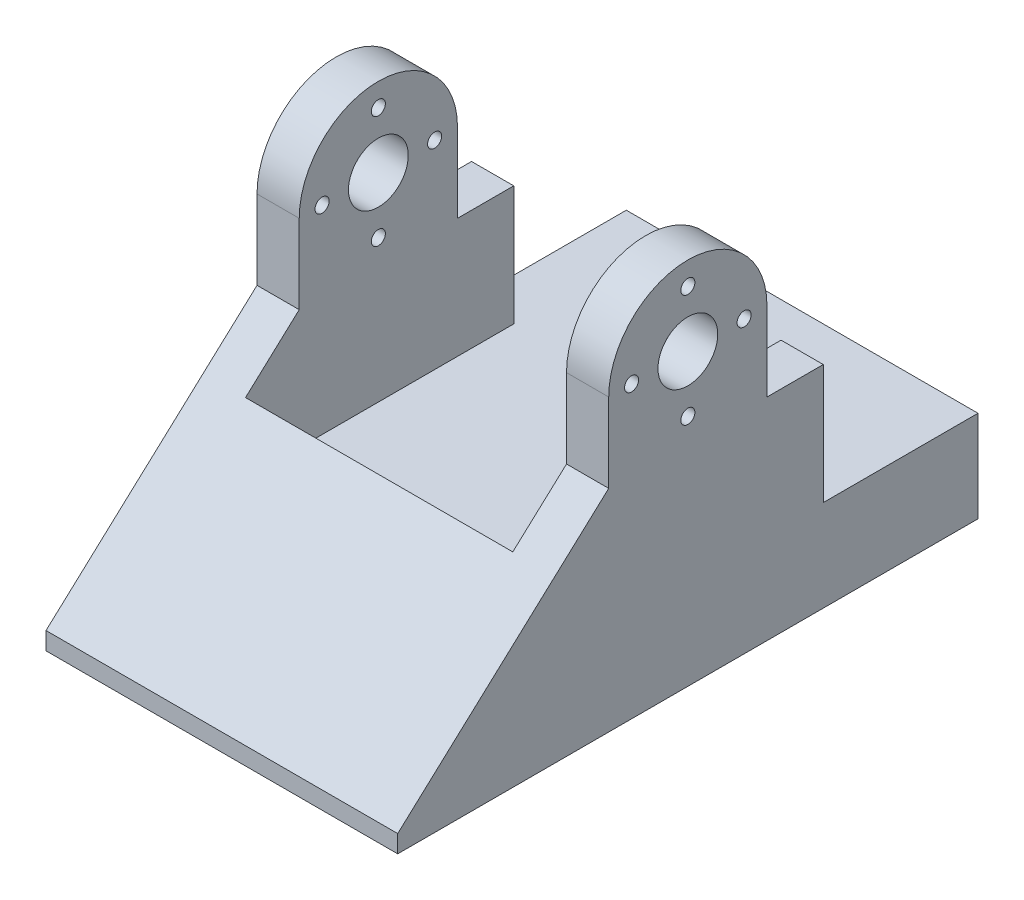
ISO-10303-21;
HEADER;
FILE_DESCRIPTION(('STEP AP214'),'2;1');
FILE_NAME('part.step','',(''),(''),'','','');
FILE_SCHEMA(('AUTOMOTIVE_DESIGN { 1 0 10303 214 1 1 1 1 }'));
ENDSEC;
DATA;
#1=APPLICATION_CONTEXT('core data for automotive mechanical design processes');
#2=APPLICATION_PROTOCOL_DEFINITION('international standard','automotive_design',2000,#1);
#3=PRODUCT_CONTEXT('',#1,'mechanical');
#4=PRODUCT('Part','Part','',(#3));
#5=PRODUCT_RELATED_PRODUCT_CATEGORY('part','',(#4));
#6=PRODUCT_DEFINITION_FORMATION('','',#4);
#7=PRODUCT_DEFINITION_CONTEXT('part definition',#1,'design');
#8=PRODUCT_DEFINITION('design','',#6,#7);
#9=PRODUCT_DEFINITION_SHAPE('','',#8);
#10=(LENGTH_UNIT() NAMED_UNIT(*) SI_UNIT(.MILLI.,.METRE.));
#11=(NAMED_UNIT(*) PLANE_ANGLE_UNIT() SI_UNIT($,.RADIAN.));
#12=(NAMED_UNIT(*) SI_UNIT($,.STERADIAN.) SOLID_ANGLE_UNIT());
#13=UNCERTAINTY_MEASURE_WITH_UNIT(LENGTH_MEASURE(1.E-05),#10,'distance_accuracy_value','');
#14=(GEOMETRIC_REPRESENTATION_CONTEXT(3) GLOBAL_UNCERTAINTY_ASSIGNED_CONTEXT((#13)) GLOBAL_UNIT_ASSIGNED_CONTEXT((#10,
#11,#12)) REPRESENTATION_CONTEXT('',''));
#15=CARTESIAN_POINT('',(0.,0.,0.));
#16=DIRECTION('',(0.,0.,1.));
#17=DIRECTION('',(1.,0.,0.));
#18=AXIS2_PLACEMENT_3D('',#15,#16,#17);
#19=CARTESIAN_POINT('',(-25.0000000000001,-24.,-46.75));
#20=DIRECTION('',(0.,0.,1.));
#21=DIRECTION('',(0.,-1.,0.));
#22=AXIS2_PLACEMENT_3D('',#19,#20,#21);
#23=PLANE('',#22);
#24=DIRECTION('',(0.,1.,0.));
#25=VECTOR('',#24,1.);
#26=CARTESIAN_POINT('',(-19.,0.,-46.75));
#27=LINE('',#26,#25);
#28=CARTESIAN_POINT('',(-19.,-41.,-46.75));
#29=VERTEX_POINT('',#28);
#30=CARTESIAN_POINT('',(-19.,-24.,-46.75));
#31=VERTEX_POINT('',#30);
#32=EDGE_CURVE('E231',#29,#31,#27,.T.);
#33=ORIENTED_EDGE('',*,*,#32,.F.);
#34=DIRECTION('',(1.,0.,0.));
#35=VECTOR('',#34,1.);
#36=CARTESIAN_POINT('',(-25.0000000000001,-41.,-46.75));
#37=LINE('',#36,#35);
#38=CARTESIAN_POINT('',(-25.0000000000001,-41.,-46.75));
#39=VERTEX_POINT('',#38);
#40=EDGE_CURVE('E197',#39,#29,#37,.T.);
#41=ORIENTED_EDGE('',*,*,#40,.F.);
#42=DIRECTION('',(0.,-1.,0.));
#43=VECTOR('',#42,1.);
#44=CARTESIAN_POINT('',(-25.0000000000001,-24.,-46.75));
#45=LINE('',#44,#43);
#46=CARTESIAN_POINT('',(-25.0000000000001,-24.,-46.75));
#47=VERTEX_POINT('',#46);
#48=EDGE_CURVE('E206',#47,#39,#45,.T.);
#49=ORIENTED_EDGE('',*,*,#48,.F.);
#50=DIRECTION('',(1.,0.,0.));
#51=VECTOR('',#50,1.);
#52=CARTESIAN_POINT('',(-25.0000000000001,-24.,-46.75));
#53=LINE('',#52,#51);
#54=EDGE_CURVE('E226',#47,#31,#53,.T.);
#55=ORIENTED_EDGE('',*,*,#54,.T.);
#56=EDGE_LOOP('',(#33,#41,#49,#55));
#57=FACE_BOUND('',#56,.T.);
#58=ADVANCED_FACE('F47',(#57),#23,.F.);
#59=CARTESIAN_POINT('',(-19.,0.,-55.));
#60=DIRECTION('',(-1.,0.,0.));
#61=DIRECTION('',(0.,-1.,0.));
#62=AXIS2_PLACEMENT_3D('',#59,#60,#61);
#63=PLANE('',#62);
#64=CARTESIAN_POINT('',(-19.,-12.75,-27.5));
#65=DIRECTION('',(-1.,0.,0.));
#66=DIRECTION('',(0.,-1.,0.));
#67=AXIS2_PLACEMENT_3D('',#64,#65,#66);
#68=CIRCLE('',#67,4.25);
#69=CARTESIAN_POINT('',(-19.,-17.,-27.5));
#70=VERTEX_POINT('',#69);
#71=EDGE_CURVE('E353',#70,#70,#68,.F.);
#72=ORIENTED_EDGE('',*,*,#71,.F.);
#73=EDGE_LOOP('',(#72));
#74=FACE_BOUND('',#73,.T.);
#75=CARTESIAN_POINT('',(-19.,-12.7499999999999,-35.5000000000001));
#76=DIRECTION('',(-1.,0.,0.));
#77=DIRECTION('',(0.,-1.,0.));
#78=AXIS2_PLACEMENT_3D('',#75,#76,#77);
#79=CIRCLE('',#78,1.00000000000001);
#80=CARTESIAN_POINT('',(-19.,-13.7499999999999,-35.5000000000001));
#81=VERTEX_POINT('',#80);
#82=EDGE_CURVE('E345',#81,#81,#79,.F.);
#83=ORIENTED_EDGE('',*,*,#82,.F.);
#84=EDGE_LOOP('',(#83));
#85=FACE_BOUND('',#84,.T.);
#86=CARTESIAN_POINT('',(-19.,-4.75000000000001,-27.5));
#87=DIRECTION('',(-1.,0.,0.));
#88=DIRECTION('',(0.,-1.,0.));
#89=AXIS2_PLACEMENT_3D('',#86,#87,#88);
#90=CIRCLE('',#89,1.);
#91=CARTESIAN_POINT('',(-19.,-5.75000000000001,-27.5));
#92=VERTEX_POINT('',#91);
#93=EDGE_CURVE('E341',#92,#92,#90,.F.);
#94=ORIENTED_EDGE('',*,*,#93,.F.);
#95=EDGE_LOOP('',(#94));
#96=FACE_BOUND('',#95,.T.);
#97=CARTESIAN_POINT('',(-19.,-20.75,-27.5000000000002));
#98=DIRECTION('',(-1.,0.,0.));
#99=DIRECTION('',(0.,-1.,0.));
#100=AXIS2_PLACEMENT_3D('',#97,#98,#99);
#101=CIRCLE('',#100,1.);
#102=CARTESIAN_POINT('',(-19.,-21.75,-27.5000000000002));
#103=VERTEX_POINT('',#102);
#104=EDGE_CURVE('E349',#103,#103,#101,.F.);
#105=ORIENTED_EDGE('',*,*,#104,.F.);
#106=EDGE_LOOP('',(#105));
#107=FACE_BOUND('',#106,.T.);
#108=CARTESIAN_POINT('',(-19.,-12.75,-19.5000000000001));
#109=DIRECTION('',(-1.,0.,0.));
#110=DIRECTION('',(0.,-1.,0.));
#111=AXIS2_PLACEMENT_3D('',#108,#109,#110);
#112=CIRCLE('',#111,1.);
#113=CARTESIAN_POINT('',(-19.,-13.75,-19.5000000000001));
#114=VERTEX_POINT('',#113);
#115=EDGE_CURVE('E357',#114,#114,#112,.F.);
#116=ORIENTED_EDGE('',*,*,#115,.F.);
#117=EDGE_LOOP('',(#116));
#118=FACE_BOUND('',#117,.T.);
#119=DIRECTION('',(0.,0.675724628517347,-0.737154140200741));
#120=VECTOR('',#119,1.);
#121=CARTESIAN_POINT('',(-19.,6.26037735849058,-49.261320754717));
#122=LINE('',#121,#120);
#123=CARTESIAN_POINT('',(-19.,-31.,-8.61363636363637));
#124=VERTEX_POINT('',#123);
#125=CARTESIAN_POINT('',(-19.,-24.,-16.25));
#126=VERTEX_POINT('',#125);
#127=EDGE_CURVE('E182',#124,#126,#122,.T.);
#128=ORIENTED_EDGE('',*,*,#127,.F.);
#129=DIRECTION('',(0.,1.,0.));
#130=VECTOR('',#129,1.);
#131=CARTESIAN_POINT('',(-19.,-41.,-8.61363636363637));
#132=LINE('',#131,#130);
#133=CARTESIAN_POINT('',(-19.,-41.,-8.61363636363637));
#134=VERTEX_POINT('',#133);
#135=EDGE_CURVE('E174',#134,#124,#132,.T.);
#136=ORIENTED_EDGE('',*,*,#135,.F.);
#137=DIRECTION('',(0.,0.,1.));
#138=VECTOR('',#137,1.);
#139=CARTESIAN_POINT('',(-19.,-41.,-46.75));
#140=LINE('',#139,#138);
#141=EDGE_CURVE('E179',#29,#134,#140,.T.);
#142=ORIENTED_EDGE('',*,*,#141,.F.);
#143=ORIENTED_EDGE('',*,*,#32,.T.);
#144=DIRECTION('',(0.,0.,1.));
#145=VECTOR('',#144,1.);
#146=CARTESIAN_POINT('',(-19.,-24.,-68.75));
#147=LINE('',#146,#145);
#148=CARTESIAN_POINT('',(-19.,-24.,-38.75));
#149=VERTEX_POINT('',#148);
#150=EDGE_CURVE('E277',#31,#149,#147,.T.);
#151=ORIENTED_EDGE('',*,*,#150,.T.);
#152=DIRECTION('',(0.,1.,0.));
#153=VECTOR('',#152,1.);
#154=CARTESIAN_POINT('',(-19.,0.,-38.75));
#155=LINE('',#154,#153);
#156=CARTESIAN_POINT('',(-19.,-12.75,-38.75));
#157=VERTEX_POINT('',#156);
#158=EDGE_CURVE('E316',#149,#157,#155,.T.);
#159=ORIENTED_EDGE('',*,*,#158,.T.);
#160=CARTESIAN_POINT('',(-19.,-12.75,-27.5));
#161=DIRECTION('',(-1.,0.,0.));
#162=DIRECTION('',(0.,-1.,0.));
#163=AXIS2_PLACEMENT_3D('',#160,#161,#162);
#164=CIRCLE('',#163,11.25);
#165=CARTESIAN_POINT('',(-19.,-12.75,-16.25));
#166=VERTEX_POINT('',#165);
#167=EDGE_CURVE('E337',#166,#157,#164,.T.);
#168=ORIENTED_EDGE('',*,*,#167,.F.);
#169=DIRECTION('',(0.,1.,0.));
#170=VECTOR('',#169,1.);
#171=CARTESIAN_POINT('',(-19.,0.,-16.25));
#172=LINE('',#171,#170);
#173=EDGE_CURVE('E334',#126,#166,#172,.T.);
#174=ORIENTED_EDGE('',*,*,#173,.F.);
#175=EDGE_LOOP('',(#128,#136,#142,#143,#151,#159,#168,#174));
#176=FACE_BOUND('',#175,.T.);
#177=ADVANCED_FACE('F176',(#74,#85,#96,#107,#118,#176),#63,.F.);
#178=CARTESIAN_POINT('',(19.,0.,-55.));
#179=DIRECTION('',(1.,0.,0.));
#180=DIRECTION('',(0.,1.,0.));
#181=AXIS2_PLACEMENT_3D('',#178,#179,#180);
#182=PLANE('',#181);
#183=CARTESIAN_POINT('',(19.,-12.75,-27.5));
#184=DIRECTION('',(1.,0.,0.));
#185=DIRECTION('',(0.,1.,0.));
#186=AXIS2_PLACEMENT_3D('',#183,#184,#185);
#187=CIRCLE('',#186,4.25);
#188=CARTESIAN_POINT('',(19.,-8.50000000000001,-27.5));
#189=VERTEX_POINT('',#188);
#190=EDGE_CURVE('E373',#189,#189,#187,.F.);
#191=ORIENTED_EDGE('',*,*,#190,.F.);
#192=EDGE_LOOP('',(#191));
#193=FACE_BOUND('',#192,.T.);
#194=CARTESIAN_POINT('',(19.,-12.7499999999999,-35.5000000000001));
#195=DIRECTION('',(1.,0.,0.));
#196=DIRECTION('',(0.,1.,0.));
#197=AXIS2_PLACEMENT_3D('',#194,#195,#196);
#198=CIRCLE('',#197,1.00000000000001);
#199=CARTESIAN_POINT('',(19.,-11.7499999999999,-35.5000000000001));
#200=VERTEX_POINT('',#199);
#201=EDGE_CURVE('E365',#200,#200,#198,.F.);
#202=ORIENTED_EDGE('',*,*,#201,.F.);
#203=EDGE_LOOP('',(#202));
#204=FACE_BOUND('',#203,.T.);
#205=CARTESIAN_POINT('',(19.,-4.75000000000001,-27.5));
#206=DIRECTION('',(1.,0.,0.));
#207=DIRECTION('',(0.,1.,0.));
#208=AXIS2_PLACEMENT_3D('',#205,#206,#207);
#209=CIRCLE('',#208,1.);
#210=CARTESIAN_POINT('',(19.,-3.75000000000001,-27.5));
#211=VERTEX_POINT('',#210);
#212=EDGE_CURVE('E361',#211,#211,#209,.F.);
#213=ORIENTED_EDGE('',*,*,#212,.F.);
#214=EDGE_LOOP('',(#213));
#215=FACE_BOUND('',#214,.T.);
#216=CARTESIAN_POINT('',(19.,-20.75,-27.5000000000002));
#217=DIRECTION('',(1.,0.,0.));
#218=DIRECTION('',(0.,1.,0.));
#219=AXIS2_PLACEMENT_3D('',#216,#217,#218);
#220=CIRCLE('',#219,1.);
#221=CARTESIAN_POINT('',(19.,-19.75,-27.5000000000002));
#222=VERTEX_POINT('',#221);
#223=EDGE_CURVE('E369',#222,#222,#220,.F.);
#224=ORIENTED_EDGE('',*,*,#223,.F.);
#225=EDGE_LOOP('',(#224));
#226=FACE_BOUND('',#225,.T.);
#227=CARTESIAN_POINT('',(19.,-12.75,-19.5000000000001));
#228=DIRECTION('',(1.,0.,0.));
#229=DIRECTION('',(0.,1.,0.));
#230=AXIS2_PLACEMENT_3D('',#227,#228,#229);
#231=CIRCLE('',#230,1.);
#232=CARTESIAN_POINT('',(19.,-11.75,-19.5000000000001));
#233=VERTEX_POINT('',#232);
#234=EDGE_CURVE('E377',#233,#233,#231,.F.);
#235=ORIENTED_EDGE('',*,*,#234,.F.);
#236=EDGE_LOOP('',(#235));
#237=FACE_BOUND('',#236,.T.);
#238=DIRECTION('',(0.,0.,1.));
#239=VECTOR('',#238,1.);
#240=CARTESIAN_POINT('',(19.,-24.,-68.75));
#241=LINE('',#240,#239);
#242=CARTESIAN_POINT('',(19.,-24.,-46.75));
#243=VERTEX_POINT('',#242);
#244=CARTESIAN_POINT('',(19.,-24.,-38.75));
#245=VERTEX_POINT('',#244);
#246=EDGE_CURVE('E276',#243,#245,#241,.T.);
#247=ORIENTED_EDGE('',*,*,#246,.F.);
#248=DIRECTION('',(0.,-1.,0.));
#249=VECTOR('',#248,1.);
#250=CARTESIAN_POINT('',(19.,0.,-46.75));
#251=LINE('',#250,#249);
#252=CARTESIAN_POINT('',(19.,-41.,-46.75));
#253=VERTEX_POINT('',#252);
#254=EDGE_CURVE('E63',#243,#253,#251,.T.);
#255=ORIENTED_EDGE('',*,*,#254,.T.);
#256=DIRECTION('',(0.,0.,-1.));
#257=VECTOR('',#256,1.);
#258=CARTESIAN_POINT('',(19.,-41.,-46.75));
#259=LINE('',#258,#257);
#260=CARTESIAN_POINT('',(19.,-41.,-8.61363636363637));
#261=VERTEX_POINT('',#260);
#262=EDGE_CURVE('E188',#261,#253,#259,.T.);
#263=ORIENTED_EDGE('',*,*,#262,.F.);
#264=DIRECTION('',(0.,1.,0.));
#265=VECTOR('',#264,1.);
#266=CARTESIAN_POINT('',(19.,-41.,-8.61363636363637));
#267=LINE('',#266,#265);
#268=CARTESIAN_POINT('',(19.,-31.,-8.61363636363637));
#269=VERTEX_POINT('',#268);
#270=EDGE_CURVE('E187',#261,#269,#267,.T.);
#271=ORIENTED_EDGE('',*,*,#270,.T.);
#272=DIRECTION('',(0.,-0.675724628517347,0.737154140200741));
#273=VECTOR('',#272,1.);
#274=CARTESIAN_POINT('',(19.,6.26037735849058,-49.261320754717));
#275=LINE('',#274,#273);
#276=CARTESIAN_POINT('',(19.,-24.,-16.25));
#277=VERTEX_POINT('',#276);
#278=EDGE_CURVE('E267',#277,#269,#275,.T.);
#279=ORIENTED_EDGE('',*,*,#278,.F.);
#280=DIRECTION('',(0.,-1.,0.));
#281=VECTOR('',#280,1.);
#282=CARTESIAN_POINT('',(19.,0.,-16.25));
#283=LINE('',#282,#281);
#284=CARTESIAN_POINT('',(19.,-12.75,-16.25));
#285=VERTEX_POINT('',#284);
#286=EDGE_CURVE('E11',#285,#277,#283,.T.);
#287=ORIENTED_EDGE('',*,*,#286,.F.);
#288=CARTESIAN_POINT('',(19.,-12.75,-27.5));
#289=DIRECTION('',(1.,0.,0.));
#290=DIRECTION('',(0.,1.,0.));
#291=AXIS2_PLACEMENT_3D('',#288,#289,#290);
#292=CIRCLE('',#291,11.25);
#293=CARTESIAN_POINT('',(19.,-12.75,-38.75));
#294=VERTEX_POINT('',#293);
#295=EDGE_CURVE('E56',#294,#285,#292,.T.);
#296=ORIENTED_EDGE('',*,*,#295,.F.);
#297=DIRECTION('',(0.,-1.,0.));
#298=VECTOR('',#297,1.);
#299=CARTESIAN_POINT('',(19.,0.,-38.75));
#300=LINE('',#299,#298);
#301=EDGE_CURVE('E385',#294,#245,#300,.T.);
#302=ORIENTED_EDGE('',*,*,#301,.T.);
#303=EDGE_LOOP('',(#247,#255,#263,#271,#279,#287,#296,#302));
#304=FACE_BOUND('',#303,.T.);
#305=ADVANCED_FACE('F444',(#193,#204,#215,#226,#237,#304),#182,.F.);
#306=CARTESIAN_POINT('',(-25.,0.,-55.));
#307=DIRECTION('',(-1.,0.,0.));
#308=DIRECTION('',(0.,-1.,0.));
#309=AXIS2_PLACEMENT_3D('',#306,#307,#308);
#310=PLANE('',#309);
#311=DIRECTION('',(0.,0.,-1.));
#312=VECTOR('',#311,1.);
#313=CARTESIAN_POINT('',(-25.0000000000001,-41.,-68.75));
#314=LINE('',#313,#312);
#315=CARTESIAN_POINT('',(-25.0000000000001,-41.,-68.75));
#316=VERTEX_POINT('',#315);
#317=EDGE_CURVE('E210',#39,#316,#314,.T.);
#318=ORIENTED_EDGE('',*,*,#317,.T.);
#319=DIRECTION('',(0.,-1.,0.));
#320=VECTOR('',#319,1.);
#321=CARTESIAN_POINT('',(-25.,0.,-68.75));
#322=LINE('',#321,#320);
#323=CARTESIAN_POINT('',(-25.,-54.,-68.75));
#324=VERTEX_POINT('',#323);
#325=EDGE_CURVE('E283',#316,#324,#322,.T.);
#326=ORIENTED_EDGE('',*,*,#325,.T.);
#327=DIRECTION('',(0.,0.,-1.));
#328=VECTOR('',#327,1.);
#329=CARTESIAN_POINT('',(-25.,-54.,-68.75));
#330=LINE('',#329,#328);
#331=CARTESIAN_POINT('',(-25.,-54.,13.75));
#332=VERTEX_POINT('',#331);
#333=EDGE_CURVE('E239',#332,#324,#330,.T.);
#334=ORIENTED_EDGE('',*,*,#333,.F.);
#335=DIRECTION('',(0.,-1.,0.));
#336=VECTOR('',#335,1.);
#337=CARTESIAN_POINT('',(-25.,-51.5,13.75));
#338=LINE('',#337,#336);
#339=CARTESIAN_POINT('',(-25.0000000000001,-51.5,13.75));
#340=VERTEX_POINT('',#339);
#341=EDGE_CURVE('E235',#340,#332,#338,.T.);
#342=ORIENTED_EDGE('',*,*,#341,.F.);
#343=DIRECTION('',(0.,-0.675724628517347,0.737154140200741));
#344=VECTOR('',#343,1.);
#345=CARTESIAN_POINT('',(-25.0000000000001,-21.1358490566038,-19.3745283018868));
#346=LINE('',#345,#344);
#347=CARTESIAN_POINT('',(-25.0000000000001,-24.,-16.25));
#348=VERTEX_POINT('',#347);
#349=EDGE_CURVE('E258',#348,#340,#346,.T.);
#350=ORIENTED_EDGE('',*,*,#349,.F.);
#351=DIRECTION('',(0.,-1.,0.));
#352=VECTOR('',#351,1.);
#353=CARTESIAN_POINT('',(-25.0000000000001,0.,-16.25));
#354=LINE('',#353,#352);
#355=CARTESIAN_POINT('',(-25.0000000000001,-12.75,-16.25));
#356=VERTEX_POINT('',#355);
#357=EDGE_CURVE('E297',#356,#348,#354,.T.);
#358=ORIENTED_EDGE('',*,*,#357,.F.);
#359=CARTESIAN_POINT('',(-25.0000000000001,-12.75,-27.5));
#360=DIRECTION('',(1.,0.,0.));
#361=DIRECTION('',(0.,1.,0.));
#362=AXIS2_PLACEMENT_3D('',#359,#360,#361);
#363=CIRCLE('',#362,11.25);
#364=CARTESIAN_POINT('',(-25.0000000000001,-12.75,-38.75));
#365=VERTEX_POINT('',#364);
#366=EDGE_CURVE('E289',#365,#356,#363,.T.);
#367=ORIENTED_EDGE('',*,*,#366,.F.);
#368=DIRECTION('',(0.,-1.,0.));
#369=VECTOR('',#368,1.);
#370=CARTESIAN_POINT('',(-25.0000000000001,0.,-38.75));
#371=LINE('',#370,#369);
#372=CARTESIAN_POINT('',(-25.0000000000001,-24.,-38.75));
#373=VERTEX_POINT('',#372);
#374=EDGE_CURVE('E292',#365,#373,#371,.T.);
#375=ORIENTED_EDGE('',*,*,#374,.T.);
#376=DIRECTION('',(0.,0.,1.));
#377=VECTOR('',#376,1.);
#378=CARTESIAN_POINT('',(-25.,-24.,0.));
#379=LINE('',#378,#377);
#380=EDGE_CURVE('E382',#47,#373,#379,.T.);
#381=ORIENTED_EDGE('',*,*,#380,.F.);
#382=ORIENTED_EDGE('',*,*,#48,.T.);
#383=EDGE_LOOP('',(#318,#326,#334,#342,#350,#358,#367,#375,#381,#382));
#384=FACE_BOUND('',#383,.T.);
#385=CARTESIAN_POINT('',(-25.,-12.75,-19.5000000000001));
#386=DIRECTION('',(1.,0.,0.));
#387=DIRECTION('',(0.,1.,0.));
#388=AXIS2_PLACEMENT_3D('',#385,#386,#387);
#389=CIRCLE('',#388,1.);
#390=CARTESIAN_POINT('',(-25.,-11.75,-19.5000000000001));
#391=VERTEX_POINT('',#390);
#392=EDGE_CURVE('E389',#391,#391,#389,.T.);
#393=ORIENTED_EDGE('',*,*,#392,.T.);
#394=EDGE_LOOP('',(#393));
#395=FACE_BOUND('',#394,.T.);
#396=CARTESIAN_POINT('',(-25.,-12.75,-27.5));
#397=DIRECTION('',(1.,0.,0.));
#398=DIRECTION('',(0.,1.,0.));
#399=AXIS2_PLACEMENT_3D('',#396,#397,#398);
#400=CIRCLE('',#399,4.25);
#401=CARTESIAN_POINT('',(-25.,-8.50000000000001,-27.5));
#402=VERTEX_POINT('',#401);
#403=EDGE_CURVE('E413',#402,#402,#400,.T.);
#404=ORIENTED_EDGE('',*,*,#403,.T.);
#405=EDGE_LOOP('',(#404));
#406=FACE_BOUND('',#405,.T.);
#407=CARTESIAN_POINT('',(-25.,-20.75,-27.5000000000002));
#408=DIRECTION('',(1.,0.,0.));
#409=DIRECTION('',(0.,1.,0.));
#410=AXIS2_PLACEMENT_3D('',#407,#408,#409);
#411=CIRCLE('',#410,1.);
#412=CARTESIAN_POINT('',(-25.,-19.75,-27.5000000000002));
#413=VERTEX_POINT('',#412);
#414=EDGE_CURVE('E421',#413,#413,#411,.T.);
#415=ORIENTED_EDGE('',*,*,#414,.T.);
#416=EDGE_LOOP('',(#415));
#417=FACE_BOUND('',#416,.T.);
#418=CARTESIAN_POINT('',(-25.,-12.7499999999999,-35.5000000000001));
#419=DIRECTION('',(1.,0.,0.));
#420=DIRECTION('',(0.,1.,0.));
#421=AXIS2_PLACEMENT_3D('',#418,#419,#420);
#422=CIRCLE('',#421,1.00000000000001);
#423=CARTESIAN_POINT('',(-25.,-11.7499999999999,-35.5000000000001));
#424=VERTEX_POINT('',#423);
#425=EDGE_CURVE('E390',#424,#424,#422,.T.);
#426=ORIENTED_EDGE('',*,*,#425,.T.);
#427=EDGE_LOOP('',(#426));
#428=FACE_BOUND('',#427,.T.);
#429=CARTESIAN_POINT('',(-25.,-4.75000000000001,-27.5));
#430=DIRECTION('',(1.,0.,0.));
#431=DIRECTION('',(0.,1.,0.));
#432=AXIS2_PLACEMENT_3D('',#429,#430,#431);
#433=CIRCLE('',#432,1.);
#434=CARTESIAN_POINT('',(-25.,-3.75000000000001,-27.5));
#435=VERTEX_POINT('',#434);
#436=EDGE_CURVE('E399',#435,#435,#433,.T.);
#437=ORIENTED_EDGE('',*,*,#436,.T.);
#438=EDGE_LOOP('',(#437));
#439=FACE_BOUND('',#438,.T.);
#440=ADVANCED_FACE('F49',(#384,#395,#406,#417,#428,#439),#310,.T.);
#441=CARTESIAN_POINT('',(25.,0.,-55.));
#442=DIRECTION('',(1.,0.,0.));
#443=DIRECTION('',(0.,1.,0.));
#444=AXIS2_PLACEMENT_3D('',#441,#442,#443);
#445=PLANE('',#444);
#446=DIRECTION('',(0.,0.,-1.));
#447=VECTOR('',#446,1.);
#448=CARTESIAN_POINT('',(25.,-41.,-68.75));
#449=LINE('',#448,#447);
#450=CARTESIAN_POINT('',(25.,-41.,-46.75));
#451=VERTEX_POINT('',#450);
#452=CARTESIAN_POINT('',(25.,-41.,-68.75));
#453=VERTEX_POINT('',#452);
#454=EDGE_CURVE('E71',#451,#453,#449,.T.);
#455=ORIENTED_EDGE('',*,*,#454,.F.);
#456=DIRECTION('',(0.,-1.,0.));
#457=VECTOR('',#456,1.);
#458=CARTESIAN_POINT('',(25.,-24.,-46.75));
#459=LINE('',#458,#457);
#460=CARTESIAN_POINT('',(25.,-24.,-46.75));
#461=VERTEX_POINT('',#460);
#462=EDGE_CURVE('E204',#461,#451,#459,.T.);
#463=ORIENTED_EDGE('',*,*,#462,.F.);
#464=DIRECTION('',(0.,0.,1.));
#465=VECTOR('',#464,1.);
#466=CARTESIAN_POINT('',(25.,-24.,0.));
#467=LINE('',#466,#465);
#468=CARTESIAN_POINT('',(25.,-24.,-38.75));
#469=VERTEX_POINT('',#468);
#470=EDGE_CURVE('E386',#461,#469,#467,.T.);
#471=ORIENTED_EDGE('',*,*,#470,.T.);
#472=DIRECTION('',(0.,-1.,0.));
#473=VECTOR('',#472,1.);
#474=CARTESIAN_POINT('',(25.,0.,-38.75));
#475=LINE('',#474,#473);
#476=CARTESIAN_POINT('',(25.,-12.75,-38.75));
#477=VERTEX_POINT('',#476);
#478=EDGE_CURVE('E305',#477,#469,#475,.T.);
#479=ORIENTED_EDGE('',*,*,#478,.F.);
#480=CARTESIAN_POINT('',(25.,-12.75,-27.5));
#481=DIRECTION('',(1.,0.,0.));
#482=DIRECTION('',(0.,1.,0.));
#483=AXIS2_PLACEMENT_3D('',#480,#481,#482);
#484=CIRCLE('',#483,11.25);
#485=CARTESIAN_POINT('',(25.,-12.75,-16.25));
#486=VERTEX_POINT('',#485);
#487=EDGE_CURVE('E286',#477,#486,#484,.T.);
#488=ORIENTED_EDGE('',*,*,#487,.T.);
#489=DIRECTION('',(0.,-1.,0.));
#490=VECTOR('',#489,1.);
#491=CARTESIAN_POINT('',(25.,0.,-16.25));
#492=LINE('',#491,#490);
#493=CARTESIAN_POINT('',(25.,-24.,-16.25));
#494=VERTEX_POINT('',#493);
#495=EDGE_CURVE('E293',#486,#494,#492,.T.);
#496=ORIENTED_EDGE('',*,*,#495,.T.);
#497=DIRECTION('',(0.,-0.675724628517347,0.737154140200741));
#498=VECTOR('',#497,1.);
#499=CARTESIAN_POINT('',(25.,-21.1358490566038,-19.3745283018868));
#500=LINE('',#499,#498);
#501=CARTESIAN_POINT('',(25.,-51.5,13.75));
#502=VERTEX_POINT('',#501);
#503=EDGE_CURVE('E255',#494,#502,#500,.T.);
#504=ORIENTED_EDGE('',*,*,#503,.T.);
#505=DIRECTION('',(0.,-1.,0.));
#506=VECTOR('',#505,1.);
#507=CARTESIAN_POINT('',(25.,-51.5,13.75));
#508=LINE('',#507,#506);
#509=CARTESIAN_POINT('',(25.,-54.,13.75));
#510=VERTEX_POINT('',#509);
#511=EDGE_CURVE('E234',#502,#510,#508,.T.);
#512=ORIENTED_EDGE('',*,*,#511,.T.);
#513=DIRECTION('',(0.,0.,-1.));
#514=VECTOR('',#513,1.);
#515=CARTESIAN_POINT('',(25.,-54.,-68.75));
#516=LINE('',#515,#514);
#517=CARTESIAN_POINT('',(25.,-54.,-68.75));
#518=VERTEX_POINT('',#517);
#519=EDGE_CURVE('E240',#510,#518,#516,.T.);
#520=ORIENTED_EDGE('',*,*,#519,.T.);
#521=DIRECTION('',(0.,-1.,0.));
#522=VECTOR('',#521,1.);
#523=CARTESIAN_POINT('',(25.,0.,-68.75));
#524=LINE('',#523,#522);
#525=EDGE_CURVE('E280',#453,#518,#524,.T.);
#526=ORIENTED_EDGE('',*,*,#525,.F.);
#527=EDGE_LOOP('',(#455,#463,#471,#479,#488,#496,#504,#512,#520,#526));
#528=FACE_BOUND('',#527,.T.);
#529=CARTESIAN_POINT('',(25.,-12.75,-19.5000000000001));
#530=DIRECTION('',(1.,0.,0.));
#531=DIRECTION('',(0.,1.,0.));
#532=AXIS2_PLACEMENT_3D('',#529,#530,#531);
#533=CIRCLE('',#532,1.);
#534=CARTESIAN_POINT('',(25.,-11.75,-19.5000000000001));
#535=VERTEX_POINT('',#534);
#536=EDGE_CURVE('E409',#535,#535,#533,.T.);
#537=ORIENTED_EDGE('',*,*,#536,.F.);
#538=EDGE_LOOP('',(#537));
#539=FACE_BOUND('',#538,.T.);
#540=CARTESIAN_POINT('',(25.,-12.75,-27.5));
#541=DIRECTION('',(1.,0.,0.));
#542=DIRECTION('',(0.,1.,0.));
#543=AXIS2_PLACEMENT_3D('',#540,#541,#542);
#544=CIRCLE('',#543,4.25);
#545=CARTESIAN_POINT('',(25.,-8.50000000000001,-27.5));
#546=VERTEX_POINT('',#545);
#547=EDGE_CURVE('E417',#546,#546,#544,.T.);
#548=ORIENTED_EDGE('',*,*,#547,.F.);
#549=EDGE_LOOP('',(#548));
#550=FACE_BOUND('',#549,.T.);
#551=CARTESIAN_POINT('',(25.,-20.75,-27.5000000000002));
#552=DIRECTION('',(1.,0.,0.));
#553=DIRECTION('',(0.,1.,0.));
#554=AXIS2_PLACEMENT_3D('',#551,#552,#553);
#555=CIRCLE('',#554,1.);
#556=CARTESIAN_POINT('',(25.,-19.75,-27.5000000000002));
#557=VERTEX_POINT('',#556);
#558=EDGE_CURVE('E394',#557,#557,#555,.T.);
#559=ORIENTED_EDGE('',*,*,#558,.F.);
#560=EDGE_LOOP('',(#559));
#561=FACE_BOUND('',#560,.T.);
#562=CARTESIAN_POINT('',(25.,-12.7499999999999,-35.5000000000001));
#563=DIRECTION('',(1.,0.,0.));
#564=DIRECTION('',(0.,1.,0.));
#565=AXIS2_PLACEMENT_3D('',#562,#563,#564);
#566=CIRCLE('',#565,1.00000000000001);
#567=CARTESIAN_POINT('',(25.,-11.7499999999999,-35.5000000000001));
#568=VERTEX_POINT('',#567);
#569=EDGE_CURVE('E395',#568,#568,#566,.T.);
#570=ORIENTED_EDGE('',*,*,#569,.F.);
#571=EDGE_LOOP('',(#570));
#572=FACE_BOUND('',#571,.T.);
#573=CARTESIAN_POINT('',(25.,-4.75000000000001,-27.5));
#574=DIRECTION('',(1.,0.,0.));
#575=DIRECTION('',(0.,1.,0.));
#576=AXIS2_PLACEMENT_3D('',#573,#574,#575);
#577=CIRCLE('',#576,1.);
#578=CARTESIAN_POINT('',(25.,-3.75,-27.5));
#579=VERTEX_POINT('',#578);
#580=EDGE_CURVE('E381',#579,#579,#577,.T.);
#581=ORIENTED_EDGE('',*,*,#580,.F.);
#582=EDGE_LOOP('',(#581));
#583=FACE_BOUND('',#582,.T.);
#584=ADVANCED_FACE('F461',(#528,#539,#550,#561,#572,#583),#445,.T.);
#585=CARTESIAN_POINT('',(-25.,-24.,0.));
#586=DIRECTION('',(0.,1.,0.));
#587=DIRECTION('',(0.,0.,1.));
#588=AXIS2_PLACEMENT_3D('',#585,#586,#587);
#589=PLANE('',#588);
#590=ORIENTED_EDGE('',*,*,#54,.F.);
#591=ORIENTED_EDGE('',*,*,#380,.T.);
#592=DIRECTION('',(1.,0.,0.));
#593=VECTOR('',#592,1.);
#594=CARTESIAN_POINT('',(-25.0000000000001,-24.,-38.75));
#595=LINE('',#594,#593);
#596=EDGE_CURVE('E323',#373,#149,#595,.T.);
#597=ORIENTED_EDGE('',*,*,#596,.T.);
#598=ORIENTED_EDGE('',*,*,#150,.F.);
#599=EDGE_LOOP('',(#590,#591,#597,#598));
#600=FACE_BOUND('',#599,.T.);
#601=ADVANCED_FACE('F489',(#600),#589,.T.);
#602=CARTESIAN_POINT('',(-25.,-12.75,-19.5000000000001));
#603=DIRECTION('',(1.,0.,0.));
#604=DIRECTION('',(0.,1.,0.));
#605=AXIS2_PLACEMENT_3D('',#602,#603,#604);
#606=CYLINDRICAL_SURFACE('',#605,1.);
#607=ORIENTED_EDGE('',*,*,#234,.T.);
#608=EDGE_LOOP('',(#607));
#609=FACE_BOUND('',#608,.T.);
#610=ORIENTED_EDGE('',*,*,#536,.T.);
#611=EDGE_LOOP('',(#610));
#612=FACE_BOUND('',#611,.T.);
#613=ADVANCED_FACE('F555',(#609,#612),#606,.F.);
#614=CARTESIAN_POINT('',(-25.,-12.75,-27.5));
#615=DIRECTION('',(1.,0.,0.));
#616=DIRECTION('',(0.,1.,0.));
#617=AXIS2_PLACEMENT_3D('',#614,#615,#616);
#618=CYLINDRICAL_SURFACE('',#617,4.25);
#619=ORIENTED_EDGE('',*,*,#190,.T.);
#620=EDGE_LOOP('',(#619));
#621=FACE_BOUND('',#620,.T.);
#622=ORIENTED_EDGE('',*,*,#547,.T.);
#623=EDGE_LOOP('',(#622));
#624=FACE_BOUND('',#623,.T.);
#625=ADVANCED_FACE('F805',(#621,#624),#618,.F.);
#626=CARTESIAN_POINT('',(-25.,-20.75,-27.5000000000002));
#627=DIRECTION('',(1.,0.,0.));
#628=DIRECTION('',(0.,1.,0.));
#629=AXIS2_PLACEMENT_3D('',#626,#627,#628);
#630=CYLINDRICAL_SURFACE('',#629,1.);
#631=ORIENTED_EDGE('',*,*,#223,.T.);
#632=EDGE_LOOP('',(#631));
#633=FACE_BOUND('',#632,.T.);
#634=ORIENTED_EDGE('',*,*,#558,.T.);
#635=EDGE_LOOP('',(#634));
#636=FACE_BOUND('',#635,.T.);
#637=ADVANCED_FACE('F795',(#633,#636),#630,.F.);
#638=CARTESIAN_POINT('',(-25.,-12.7499999999999,-35.5000000000001));
#639=DIRECTION('',(1.,0.,0.));
#640=DIRECTION('',(0.,1.,0.));
#641=AXIS2_PLACEMENT_3D('',#638,#639,#640);
#642=CYLINDRICAL_SURFACE('',#641,1.00000000000001);
#643=ORIENTED_EDGE('',*,*,#201,.T.);
#644=EDGE_LOOP('',(#643));
#645=FACE_BOUND('',#644,.T.);
#646=ORIENTED_EDGE('',*,*,#569,.T.);
#647=EDGE_LOOP('',(#646));
#648=FACE_BOUND('',#647,.T.);
#649=ADVANCED_FACE('F785',(#645,#648),#642,.F.);
#650=CARTESIAN_POINT('',(-25.,-4.75000000000001,-27.5));
#651=DIRECTION('',(1.,0.,0.));
#652=DIRECTION('',(0.,1.,0.));
#653=AXIS2_PLACEMENT_3D('',#650,#651,#652);
#654=CYLINDRICAL_SURFACE('',#653,1.);
#655=ORIENTED_EDGE('',*,*,#212,.T.);
#656=EDGE_LOOP('',(#655));
#657=FACE_BOUND('',#656,.T.);
#658=ORIENTED_EDGE('',*,*,#580,.T.);
#659=EDGE_LOOP('',(#658));
#660=FACE_BOUND('',#659,.T.);
#661=ADVANCED_FACE('F775',(#657,#660),#654,.F.);
#662=ORIENTED_EDGE('',*,*,#115,.T.);
#663=EDGE_LOOP('',(#662));
#664=FACE_BOUND('',#663,.T.);
#665=ORIENTED_EDGE('',*,*,#392,.F.);
#666=EDGE_LOOP('',(#665));
#667=FACE_BOUND('',#666,.T.);
#668=ADVANCED_FACE('F802',(#664,#667),#606,.F.);
#669=ORIENTED_EDGE('',*,*,#71,.T.);
#670=EDGE_LOOP('',(#669));
#671=FACE_BOUND('',#670,.T.);
#672=ORIENTED_EDGE('',*,*,#403,.F.);
#673=EDGE_LOOP('',(#672));
#674=FACE_BOUND('',#673,.T.);
#675=ADVANCED_FACE('F792',(#671,#674),#618,.F.);
#676=ORIENTED_EDGE('',*,*,#104,.T.);
#677=EDGE_LOOP('',(#676));
#678=FACE_BOUND('',#677,.T.);
#679=ORIENTED_EDGE('',*,*,#414,.F.);
#680=EDGE_LOOP('',(#679));
#681=FACE_BOUND('',#680,.T.);
#682=ADVANCED_FACE('F782',(#678,#681),#630,.F.);
#683=ORIENTED_EDGE('',*,*,#82,.T.);
#684=EDGE_LOOP('',(#683));
#685=FACE_BOUND('',#684,.T.);
#686=ORIENTED_EDGE('',*,*,#425,.F.);
#687=EDGE_LOOP('',(#686));
#688=FACE_BOUND('',#687,.T.);
#689=ADVANCED_FACE('F772',(#685,#688),#642,.F.);
#690=ORIENTED_EDGE('',*,*,#93,.T.);
#691=EDGE_LOOP('',(#690));
#692=FACE_BOUND('',#691,.T.);
#693=ORIENTED_EDGE('',*,*,#436,.F.);
#694=EDGE_LOOP('',(#693));
#695=FACE_BOUND('',#694,.T.);
#696=ADVANCED_FACE('F547',(#692,#695),#654,.F.);
#697=EDGE_CURVE('E214',#243,#461,#53,.T.);
#698=ORIENTED_EDGE('',*,*,#697,.F.);
#699=ORIENTED_EDGE('',*,*,#246,.T.);
#700=EDGE_CURVE('E327',#245,#469,#595,.T.);
#701=ORIENTED_EDGE('',*,*,#700,.T.);
#702=ORIENTED_EDGE('',*,*,#470,.F.);
#703=EDGE_LOOP('',(#698,#699,#701,#702));
#704=FACE_BOUND('',#703,.T.);
#705=ADVANCED_FACE('F465',(#704),#589,.T.);
#706=CARTESIAN_POINT('',(-25.0000000000001,0.,-16.25));
#707=DIRECTION('',(0.,0.,1.));
#708=DIRECTION('',(1.,0.,0.));
#709=AXIS2_PLACEMENT_3D('',#706,#707,#708);
#710=PLANE('',#709);
#711=ORIENTED_EDGE('',*,*,#286,.T.);
#712=DIRECTION('',(1.,0.,0.));
#713=VECTOR('',#712,1.);
#714=CARTESIAN_POINT('',(-25.0000000000001,-24.,-16.25));
#715=LINE('',#714,#713);
#716=EDGE_CURVE('E322',#277,#494,#715,.T.);
#717=ORIENTED_EDGE('',*,*,#716,.T.);
#718=ORIENTED_EDGE('',*,*,#495,.F.);
#719=DIRECTION('',(1.,0.,0.));
#720=VECTOR('',#719,1.);
#721=CARTESIAN_POINT('',(-25.0000000000001,-12.75,-16.25));
#722=LINE('',#721,#720);
#723=EDGE_CURVE('E317',#285,#486,#722,.T.);
#724=ORIENTED_EDGE('',*,*,#723,.F.);
#725=EDGE_LOOP('',(#711,#717,#718,#724));
#726=FACE_BOUND('',#725,.T.);
#727=ADVANCED_FACE('F440',(#726),#710,.T.);
#728=CARTESIAN_POINT('',(-25.0000000000001,0.,-38.75));
#729=DIRECTION('',(0.,0.,1.));
#730=DIRECTION('',(1.,0.,0.));
#731=AXIS2_PLACEMENT_3D('',#728,#729,#730);
#732=PLANE('',#731);
#733=DIRECTION('',(1.,0.,0.));
#734=VECTOR('',#733,1.);
#735=CARTESIAN_POINT('',(-25.0000000000001,-12.75,-38.75));
#736=LINE('',#735,#734);
#737=EDGE_CURVE('E301',#294,#477,#736,.T.);
#738=ORIENTED_EDGE('',*,*,#737,.T.);
#739=ORIENTED_EDGE('',*,*,#478,.T.);
#740=ORIENTED_EDGE('',*,*,#700,.F.);
#741=ORIENTED_EDGE('',*,*,#301,.F.);
#742=EDGE_LOOP('',(#738,#739,#740,#741));
#743=FACE_BOUND('',#742,.T.);
#744=ADVANCED_FACE('F468',(#743),#732,.F.);
#745=CARTESIAN_POINT('',(-25.0000000000001,-12.75,-27.5));
#746=DIRECTION('',(1.,0.,0.));
#747=DIRECTION('',(0.,1.,0.));
#748=AXIS2_PLACEMENT_3D('',#745,#746,#747);
#749=CYLINDRICAL_SURFACE('',#748,11.25);
#750=ORIENTED_EDGE('',*,*,#295,.T.);
#751=ORIENTED_EDGE('',*,*,#723,.T.);
#752=ORIENTED_EDGE('',*,*,#487,.F.);
#753=ORIENTED_EDGE('',*,*,#737,.F.);
#754=EDGE_LOOP('',(#750,#751,#752,#753));
#755=FACE_BOUND('',#754,.T.);
#756=ADVANCED_FACE('F435',(#755),#749,.T.);
#757=ORIENTED_EDGE('',*,*,#167,.T.);
#758=EDGE_CURVE('E328',#365,#157,#736,.T.);
#759=ORIENTED_EDGE('',*,*,#758,.F.);
#760=ORIENTED_EDGE('',*,*,#366,.T.);
#761=EDGE_CURVE('E312',#356,#166,#722,.T.);
#762=ORIENTED_EDGE('',*,*,#761,.T.);
#763=EDGE_LOOP('',(#757,#759,#760,#762));
#764=FACE_BOUND('',#763,.T.);
#765=ADVANCED_FACE('F498',(#764),#749,.T.);
#766=ORIENTED_EDGE('',*,*,#173,.T.);
#767=ORIENTED_EDGE('',*,*,#761,.F.);
#768=ORIENTED_EDGE('',*,*,#357,.T.);
#769=EDGE_CURVE('E318',#348,#126,#715,.T.);
#770=ORIENTED_EDGE('',*,*,#769,.T.);
#771=EDGE_LOOP('',(#766,#767,#768,#770));
#772=FACE_BOUND('',#771,.T.);
#773=ADVANCED_FACE('F501',(#772),#710,.T.);
#774=ORIENTED_EDGE('',*,*,#596,.F.);
#775=ORIENTED_EDGE('',*,*,#374,.F.);
#776=ORIENTED_EDGE('',*,*,#758,.T.);
#777=ORIENTED_EDGE('',*,*,#158,.F.);
#778=EDGE_LOOP('',(#774,#775,#776,#777));
#779=FACE_BOUND('',#778,.T.);
#780=ADVANCED_FACE('F494',(#779),#732,.F.);
#781=CARTESIAN_POINT('',(-25.,0.,-68.75));
#782=DIRECTION('',(0.,0.,1.));
#783=DIRECTION('',(1.,0.,0.));
#784=AXIS2_PLACEMENT_3D('',#781,#782,#783);
#785=PLANE('',#784);
#786=ORIENTED_EDGE('',*,*,#325,.F.);
#787=DIRECTION('',(1.,0.,0.));
#788=VECTOR('',#787,1.);
#789=CARTESIAN_POINT('',(-25.0000000000001,-41.,-68.75));
#790=LINE('',#789,#788);
#791=EDGE_CURVE('E220',#316,#453,#790,.T.);
#792=ORIENTED_EDGE('',*,*,#791,.T.);
#793=ORIENTED_EDGE('',*,*,#525,.T.);
#794=DIRECTION('',(1.,0.,0.));
#795=VECTOR('',#794,1.);
#796=CARTESIAN_POINT('',(-25.,-54.,-68.75));
#797=LINE('',#796,#795);
#798=EDGE_CURVE('E251',#324,#518,#797,.T.);
#799=ORIENTED_EDGE('',*,*,#798,.F.);
#800=EDGE_LOOP('',(#786,#792,#793,#799));
#801=FACE_BOUND('',#800,.T.);
#802=ADVANCED_FACE('F481',(#801),#785,.F.);
#803=CARTESIAN_POINT('',(-25.0000000000001,-21.1358490566038,-19.3745283018868));
#804=DIRECTION('',(0.,0.737154140200741,0.675724628517347));
#805=DIRECTION('',(0.,-0.675724628517347,0.737154140200741));
#806=AXIS2_PLACEMENT_3D('',#803,#804,#805);
#807=PLANE('',#806);
#808=ORIENTED_EDGE('',*,*,#127,.T.);
#809=ORIENTED_EDGE('',*,*,#769,.F.);
#810=ORIENTED_EDGE('',*,*,#349,.T.);
#811=DIRECTION('',(1.,0.,0.));
#812=VECTOR('',#811,1.);
#813=CARTESIAN_POINT('',(-25.0000000000001,-51.5,13.75));
#814=LINE('',#813,#812);
#815=EDGE_CURVE('E273',#340,#502,#814,.T.);
#816=ORIENTED_EDGE('',*,*,#815,.T.);
#817=ORIENTED_EDGE('',*,*,#503,.F.);
#818=ORIENTED_EDGE('',*,*,#716,.F.);
#819=ORIENTED_EDGE('',*,*,#278,.T.);
#820=DIRECTION('',(-1.,0.,0.));
#821=VECTOR('',#820,1.);
#822=CARTESIAN_POINT('',(-19.,-31.,-8.61363636363637));
#823=LINE('',#822,#821);
#824=EDGE_CURVE('E261',#269,#124,#823,.T.);
#825=ORIENTED_EDGE('',*,*,#824,.T.);
#826=EDGE_LOOP('',(#808,#809,#810,#816,#817,#818,#819,#825));
#827=FACE_BOUND('',#826,.T.);
#828=ADVANCED_FACE('F446',(#827),#807,.T.);
#829=CARTESIAN_POINT('',(-25.,-54.,-68.75));
#830=DIRECTION('',(0.,-1.,0.));
#831=DIRECTION('',(1.,0.,0.));
#832=AXIS2_PLACEMENT_3D('',#829,#830,#831);
#833=PLANE('',#832);
#834=ORIENTED_EDGE('',*,*,#519,.F.);
#835=DIRECTION('',(1.,0.,0.));
#836=VECTOR('',#835,1.);
#837=CARTESIAN_POINT('',(-25.,-54.,13.75));
#838=LINE('',#837,#836);
#839=EDGE_CURVE('E244',#332,#510,#838,.T.);
#840=ORIENTED_EDGE('',*,*,#839,.F.);
#841=ORIENTED_EDGE('',*,*,#333,.T.);
#842=ORIENTED_EDGE('',*,*,#798,.T.);
#843=EDGE_LOOP('',(#834,#840,#841,#842));
#844=FACE_BOUND('',#843,.T.);
#845=ADVANCED_FACE('F477',(#844),#833,.T.);
#846=CARTESIAN_POINT('',(-25.,-51.5,13.75));
#847=DIRECTION('',(0.,0.,1.));
#848=DIRECTION('',(1.,0.,0.));
#849=AXIS2_PLACEMENT_3D('',#846,#847,#848);
#850=PLANE('',#849);
#851=ORIENTED_EDGE('',*,*,#511,.F.);
#852=ORIENTED_EDGE('',*,*,#815,.F.);
#853=ORIENTED_EDGE('',*,*,#341,.T.);
#854=ORIENTED_EDGE('',*,*,#839,.T.);
#855=EDGE_LOOP('',(#851,#852,#853,#854));
#856=FACE_BOUND('',#855,.T.);
#857=ADVANCED_FACE('F473',(#856),#850,.T.);
#858=EDGE_CURVE('E225',#253,#451,#37,.T.);
#859=ORIENTED_EDGE('',*,*,#858,.F.);
#860=ORIENTED_EDGE('',*,*,#254,.F.);
#861=ORIENTED_EDGE('',*,*,#697,.T.);
#862=ORIENTED_EDGE('',*,*,#462,.T.);
#863=EDGE_LOOP('',(#859,#860,#861,#862));
#864=FACE_BOUND('',#863,.T.);
#865=ADVANCED_FACE('F457',(#864),#23,.F.);
#866=CARTESIAN_POINT('',(-25.0000000000001,-41.,-68.75));
#867=DIRECTION('',(0.,-1.,0.));
#868=DIRECTION('',(1.,0.,0.));
#869=AXIS2_PLACEMENT_3D('',#866,#867,#868);
#870=PLANE('',#869);
#871=ORIENTED_EDGE('',*,*,#454,.T.);
#872=ORIENTED_EDGE('',*,*,#791,.F.);
#873=ORIENTED_EDGE('',*,*,#317,.F.);
#874=ORIENTED_EDGE('',*,*,#40,.T.);
#875=ORIENTED_EDGE('',*,*,#141,.T.);
#876=DIRECTION('',(1.,0.,0.));
#877=VECTOR('',#876,1.);
#878=CARTESIAN_POINT('',(-19.,-41.,-8.61363636363637));
#879=LINE('',#878,#877);
#880=EDGE_CURVE('E191',#134,#261,#879,.T.);
#881=ORIENTED_EDGE('',*,*,#880,.T.);
#882=ORIENTED_EDGE('',*,*,#262,.T.);
#883=ORIENTED_EDGE('',*,*,#858,.T.);
#884=EDGE_LOOP('',(#871,#872,#873,#874,#875,#881,#882,#883));
#885=FACE_BOUND('',#884,.T.);
#886=ADVANCED_FACE('F195',(#885),#870,.F.);
#887=CARTESIAN_POINT('',(-19.,-41.,-8.61363636363637));
#888=DIRECTION('',(0.,0.,1.));
#889=DIRECTION('',(1.,0.,0.));
#890=AXIS2_PLACEMENT_3D('',#887,#888,#889);
#891=PLANE('',#890);
#892=ORIENTED_EDGE('',*,*,#824,.F.);
#893=ORIENTED_EDGE('',*,*,#270,.F.);
#894=ORIENTED_EDGE('',*,*,#880,.F.);
#895=ORIENTED_EDGE('',*,*,#135,.T.);
#896=EDGE_LOOP('',(#892,#893,#894,#895));
#897=FACE_BOUND('',#896,.T.);
#898=ADVANCED_FACE('F192',(#897),#891,.F.);
#899=CLOSED_SHELL('',(#58,#177,#305,#440,#584,#601,#613,#625,#637,#649,#661,#668,#675,#682,#689,
#696,#705,#727,#744,#756,#765,#773,#780,#802,#828,#845,#857,#865,#886,#898));
#900=MANIFOLD_SOLID_BREP('B2',#899);
#901=ADVANCED_BREP_SHAPE_REPRESENTATION('',(#18,#900),#14);
#902=SHAPE_DEFINITION_REPRESENTATION(#9,#901);
ENDSEC;
END-ISO-10303-21;
